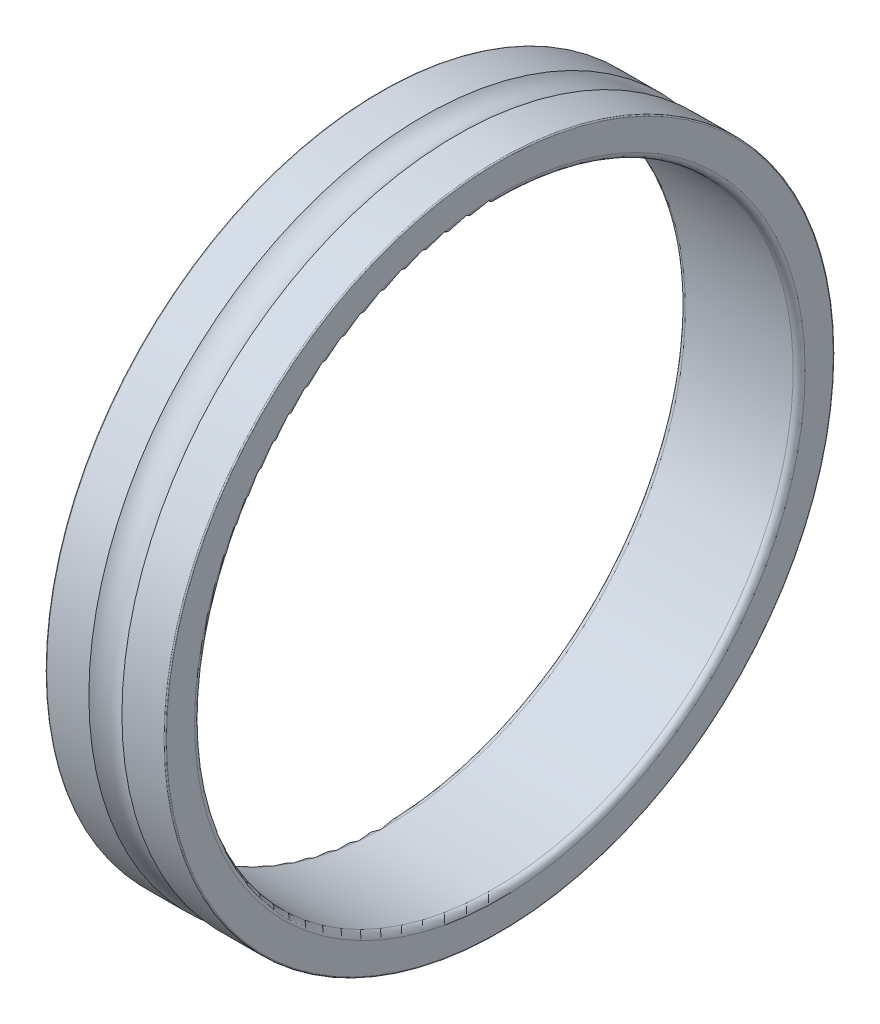
ISO-10303-21;
HEADER;
FILE_DESCRIPTION(('STEP AP214'),'2;1');
FILE_NAME('part.step','',(''),(''),'','','');
FILE_SCHEMA(('AUTOMOTIVE_DESIGN { 1 0 10303 214 1 1 1 1 }'));
ENDSEC;
DATA;
#1=APPLICATION_CONTEXT('core data for automotive mechanical design processes');
#2=APPLICATION_PROTOCOL_DEFINITION('international standard','automotive_design',2000,#1);
#3=PRODUCT_CONTEXT('',#1,'mechanical');
#4=PRODUCT('Part','Part','',(#3));
#5=PRODUCT_RELATED_PRODUCT_CATEGORY('part','',(#4));
#6=PRODUCT_DEFINITION_FORMATION('','',#4);
#7=PRODUCT_DEFINITION_CONTEXT('part definition',#1,'design');
#8=PRODUCT_DEFINITION('design','',#6,#7);
#9=PRODUCT_DEFINITION_SHAPE('','',#8);
#10=(LENGTH_UNIT() NAMED_UNIT(*) SI_UNIT(.MILLI.,.METRE.));
#11=(NAMED_UNIT(*) PLANE_ANGLE_UNIT() SI_UNIT($,.RADIAN.));
#12=(NAMED_UNIT(*) SI_UNIT($,.STERADIAN.) SOLID_ANGLE_UNIT());
#13=UNCERTAINTY_MEASURE_WITH_UNIT(LENGTH_MEASURE(1.E-05),#10,'distance_accuracy_value','');
#14=(GEOMETRIC_REPRESENTATION_CONTEXT(3) GLOBAL_UNCERTAINTY_ASSIGNED_CONTEXT((#13)) GLOBAL_UNIT_ASSIGNED_CONTEXT((#10,
#11,#12)) REPRESENTATION_CONTEXT('',''));
#15=CARTESIAN_POINT('',(0.,0.,0.));
#16=DIRECTION('',(0.,0.,1.));
#17=DIRECTION('',(1.,0.,0.));
#18=AXIS2_PLACEMENT_3D('',#15,#16,#17);
#19=CARTESIAN_POINT('',(0.,-11.4443888816351,-11.14));
#20=DIRECTION('',(-1.,0.,0.));
#21=DIRECTION('',(0.,0.,1.));
#22=AXIS2_PLACEMENT_3D('',#19,#20,#21);
#23=PLANE('',#22);
#24=CARTESIAN_POINT('',(0.,0.,0.));
#25=DIRECTION('',(-1.,0.,0.));
#26=DIRECTION('',(0.,0.,-1.));
#27=AXIS2_PLACEMENT_3D('',#24,#25,#26);
#28=CIRCLE('',#27,11.14);
#29=CARTESIAN_POINT('',(0.,0.,-11.14));
#30=VERTEX_POINT('',#29);
#31=EDGE_CURVE('E50',#30,#30,#28,.F.);
#32=ORIENTED_EDGE('',*,*,#31,.F.);
#33=EDGE_LOOP('',(#32));
#34=FACE_BOUND('',#33,.T.);
#35=CARTESIAN_POINT('',(0.,0.,0.));
#36=DIRECTION('',(1.,0.,0.));
#37=DIRECTION('',(0.,0.,1.));
#38=AXIS2_PLACEMENT_3D('',#35,#36,#37);
#39=CIRCLE('',#38,10.2000000000005);
#40=CARTESIAN_POINT('',(0.,0.,10.2000000000005));
#41=VERTEX_POINT('',#40);
#42=EDGE_CURVE('E47',#41,#41,#39,.T.);
#43=ORIENTED_EDGE('',*,*,#42,.T.);
#44=EDGE_LOOP('',(#43));
#45=FACE_BOUND('',#44,.T.);
#46=ADVANCED_FACE('F15',(#34,#45),#23,.T.);
#47=CARTESIAN_POINT('',(4.,-11.4443888883191,11.14));
#48=DIRECTION('',(1.,0.,0.));
#49=DIRECTION('',(0.,0.,-1.));
#50=AXIS2_PLACEMENT_3D('',#47,#48,#49);
#51=PLANE('',#50);
#52=CARTESIAN_POINT('',(4.,0.,0.));
#53=DIRECTION('',(1.,0.,0.));
#54=DIRECTION('',(0.,0.,1.));
#55=AXIS2_PLACEMENT_3D('',#52,#53,#54);
#56=CIRCLE('',#55,11.14);
#57=CARTESIAN_POINT('',(4.,0.,11.14));
#58=VERTEX_POINT('',#57);
#59=EDGE_CURVE('E44',#58,#58,#56,.T.);
#60=ORIENTED_EDGE('',*,*,#59,.T.);
#61=EDGE_LOOP('',(#60));
#62=FACE_BOUND('',#61,.T.);
#63=CARTESIAN_POINT('',(4.,0.,0.));
#64=DIRECTION('',(-1.,0.,0.));
#65=DIRECTION('',(0.,0.,-1.));
#66=AXIS2_PLACEMENT_3D('',#63,#64,#65);
#67=CIRCLE('',#66,10.2);
#68=CARTESIAN_POINT('',(4.,0.,-10.2));
#69=VERTEX_POINT('',#68);
#70=EDGE_CURVE('E41',#69,#69,#67,.F.);
#71=ORIENTED_EDGE('',*,*,#70,.F.);
#72=EDGE_LOOP('',(#71));
#73=FACE_BOUND('',#72,.T.);
#74=ADVANCED_FACE('F59',(#62,#73),#51,.T.);
#75=CARTESIAN_POINT('',(0.0400000000007904,0.,0.));
#76=DIRECTION('',(1.,0.,0.));
#77=DIRECTION('',(0.,1.16850852361503E-09,1.));
#78=AXIS2_PLACEMENT_3D('',#75,#76,#77);
#79=TOROIDAL_SURFACE('',#78,11.1399999999992,0.0400000000007894);
#80=ORIENTED_EDGE('',*,*,#31,.T.);
#81=EDGE_LOOP('',(#80));
#82=FACE_BOUND('',#81,.T.);
#83=CARTESIAN_POINT('',(0.0400000000007904,0.,0.));
#84=DIRECTION('',(-1.,0.,0.));
#85=DIRECTION('',(0.,0.,-1.));
#86=AXIS2_PLACEMENT_3D('',#83,#84,#85);
#87=CIRCLE('',#86,11.18);
#88=CARTESIAN_POINT('',(0.0400000000007904,0.,-11.18));
#89=VERTEX_POINT('',#88);
#90=EDGE_CURVE('E38',#89,#89,#87,.F.);
#91=ORIENTED_EDGE('',*,*,#90,.F.);
#92=EDGE_LOOP('',(#91));
#93=FACE_BOUND('',#92,.T.);
#94=ADVANCED_FACE('F54',(#82,#93),#79,.T.);
#95=CARTESIAN_POINT('',(0.200000000000528,0.,0.));
#96=DIRECTION('',(1.,0.,0.));
#97=DIRECTION('',(0.,0.,1.));
#98=AXIS2_PLACEMENT_3D('',#95,#96,#97);
#99=TOROIDAL_SURFACE('',#98,10.2000000000005,0.200000000000528);
#100=CARTESIAN_POINT('',(0.2,0.,0.));
#101=DIRECTION('',(1.,0.,0.));
#102=DIRECTION('',(0.,0.,1.));
#103=AXIS2_PLACEMENT_3D('',#100,#101,#102);
#104=CIRCLE('',#103,9.99999999999999);
#105=CARTESIAN_POINT('',(0.2,0.,9.99999999999999));
#106=VERTEX_POINT('',#105);
#107=EDGE_CURVE('E35',#106,#106,#104,.T.);
#108=ORIENTED_EDGE('',*,*,#107,.T.);
#109=EDGE_LOOP('',(#108));
#110=FACE_BOUND('',#109,.T.);
#111=ORIENTED_EDGE('',*,*,#42,.F.);
#112=EDGE_LOOP('',(#111));
#113=FACE_BOUND('',#112,.T.);
#114=ADVANCED_FACE('F63',(#110,#113),#99,.T.);
#115=CARTESIAN_POINT('',(50.,0.,0.));
#116=DIRECTION('',(1.,0.,0.));
#117=DIRECTION('',(0.,0.,1.));
#118=AXIS2_PLACEMENT_3D('',#115,#116,#117);
#119=CYLINDRICAL_SURFACE('',#118,10.);
#120=CARTESIAN_POINT('',(3.8,0.,0.));
#121=DIRECTION('',(1.,0.,0.));
#122=DIRECTION('',(0.,0.,1.));
#123=AXIS2_PLACEMENT_3D('',#120,#121,#122);
#124=CIRCLE('',#123,10.);
#125=CARTESIAN_POINT('',(3.8,0.,10.));
#126=VERTEX_POINT('',#125);
#127=EDGE_CURVE('E30',#126,#126,#124,.T.);
#128=ORIENTED_EDGE('',*,*,#127,.T.);
#129=EDGE_LOOP('',(#128));
#130=FACE_BOUND('',#129,.T.);
#131=ORIENTED_EDGE('',*,*,#107,.F.);
#132=EDGE_LOOP('',(#131));
#133=FACE_BOUND('',#132,.T.);
#134=ADVANCED_FACE('F65',(#130,#133),#119,.F.);
#135=CARTESIAN_POINT('',(3.79999999999945,0.,0.));
#136=DIRECTION('',(1.,0.,0.));
#137=DIRECTION('',(0.,0.,1.));
#138=AXIS2_PLACEMENT_3D('',#135,#136,#137);
#139=TOROIDAL_SURFACE('',#138,10.2000000000005,0.200000000000543);
#140=ORIENTED_EDGE('',*,*,#70,.T.);
#141=EDGE_LOOP('',(#140));
#142=FACE_BOUND('',#141,.T.);
#143=ORIENTED_EDGE('',*,*,#127,.F.);
#144=EDGE_LOOP('',(#143));
#145=FACE_BOUND('',#144,.T.);
#146=ADVANCED_FACE('F73',(#142,#145),#139,.T.);
#147=CARTESIAN_POINT('',(3.95999999999927,0.,0.));
#148=DIRECTION('',(1.,0.,0.));
#149=DIRECTION('',(0.,0.,1.));
#150=AXIS2_PLACEMENT_3D('',#147,#148,#149);
#151=TOROIDAL_SURFACE('',#150,11.1399999999993,0.0400000000007252);
#152=CARTESIAN_POINT('',(3.95999999999927,0.,0.));
#153=DIRECTION('',(1.,0.,0.));
#154=DIRECTION('',(0.,0.,1.));
#155=AXIS2_PLACEMENT_3D('',#152,#153,#154);
#156=CIRCLE('',#155,11.18);
#157=CARTESIAN_POINT('',(3.95999999999927,0.,11.18));
#158=VERTEX_POINT('',#157);
#159=EDGE_CURVE('E26',#158,#158,#156,.T.);
#160=ORIENTED_EDGE('',*,*,#159,.T.);
#161=EDGE_LOOP('',(#160));
#162=FACE_BOUND('',#161,.T.);
#163=ORIENTED_EDGE('',*,*,#59,.F.);
#164=EDGE_LOOP('',(#163));
#165=FACE_BOUND('',#164,.T.);
#166=ADVANCED_FACE('F81',(#162,#165),#151,.T.);
#167=CARTESIAN_POINT('',(50.,0.,0.));
#168=DIRECTION('',(1.,0.,0.));
#169=DIRECTION('',(0.,0.,1.));
#170=AXIS2_PLACEMENT_3D('',#167,#168,#169);
#171=CYLINDRICAL_SURFACE('',#170,11.18);
#172=CARTESIAN_POINT('',(2.552753109444,0.,0.));
#173=DIRECTION('',(1.,0.,0.));
#174=DIRECTION('',(0.,0.,1.));
#175=AXIS2_PLACEMENT_3D('',#172,#173,#174);
#176=CIRCLE('',#175,11.18);
#177=CARTESIAN_POINT('',(2.552753109444,0.,11.18));
#178=VERTEX_POINT('',#177);
#179=EDGE_CURVE('E22',#178,#178,#176,.T.);
#180=ORIENTED_EDGE('',*,*,#179,.T.);
#181=EDGE_LOOP('',(#180));
#182=FACE_BOUND('',#181,.T.);
#183=ORIENTED_EDGE('',*,*,#159,.F.);
#184=EDGE_LOOP('',(#183));
#185=FACE_BOUND('',#184,.T.);
#186=ADVANCED_FACE('F85',(#182,#185),#171,.T.);
#187=CARTESIAN_POINT('',(2.,0.,0.));
#188=DIRECTION('',(1.,0.,0.));
#189=DIRECTION('',(0.,0.,1.));
#190=AXIS2_PLACEMENT_3D('',#187,#188,#189);
#191=TOROIDAL_SURFACE('',#190,11.75,0.794000000000024);
#192=ORIENTED_EDGE('',*,*,#179,.F.);
#193=EDGE_LOOP('',(#192));
#194=FACE_BOUND('',#193,.T.);
#195=CARTESIAN_POINT('',(1.44724689055599,0.,0.));
#196=DIRECTION('',(1.,0.,0.));
#197=DIRECTION('',(0.,0.,1.));
#198=AXIS2_PLACEMENT_3D('',#195,#196,#197);
#199=CIRCLE('',#198,11.18);
#200=CARTESIAN_POINT('',(1.44724689055599,0.,11.18));
#201=VERTEX_POINT('',#200);
#202=EDGE_CURVE('E10',#201,#201,#199,.T.);
#203=ORIENTED_EDGE('',*,*,#202,.T.);
#204=EDGE_LOOP('',(#203));
#205=FACE_BOUND('',#204,.T.);
#206=ADVANCED_FACE('F88',(#194,#205),#191,.F.);
#207=CARTESIAN_POINT('',(50.,0.,0.));
#208=DIRECTION('',(1.,0.,0.));
#209=DIRECTION('',(0.,7.69302966115301E-10,1.));
#210=AXIS2_PLACEMENT_3D('',#207,#208,#209);
#211=CYLINDRICAL_SURFACE('',#210,11.18);
#212=ORIENTED_EDGE('',*,*,#90,.T.);
#213=EDGE_LOOP('',(#212));
#214=FACE_BOUND('',#213,.T.);
#215=ORIENTED_EDGE('',*,*,#202,.F.);
#216=EDGE_LOOP('',(#215));
#217=FACE_BOUND('',#216,.T.);
#218=ADVANCED_FACE('F17',(#214,#217),#211,.T.);
#219=CLOSED_SHELL('',(#46,#74,#94,#114,#134,#146,#166,#186,#206,#218));
#220=MANIFOLD_SOLID_BREP('B1',#219);
#221=ADVANCED_BREP_SHAPE_REPRESENTATION('',(#18,#220),#14);
#222=SHAPE_DEFINITION_REPRESENTATION(#9,#221);
ENDSEC;
END-ISO-10303-21;
